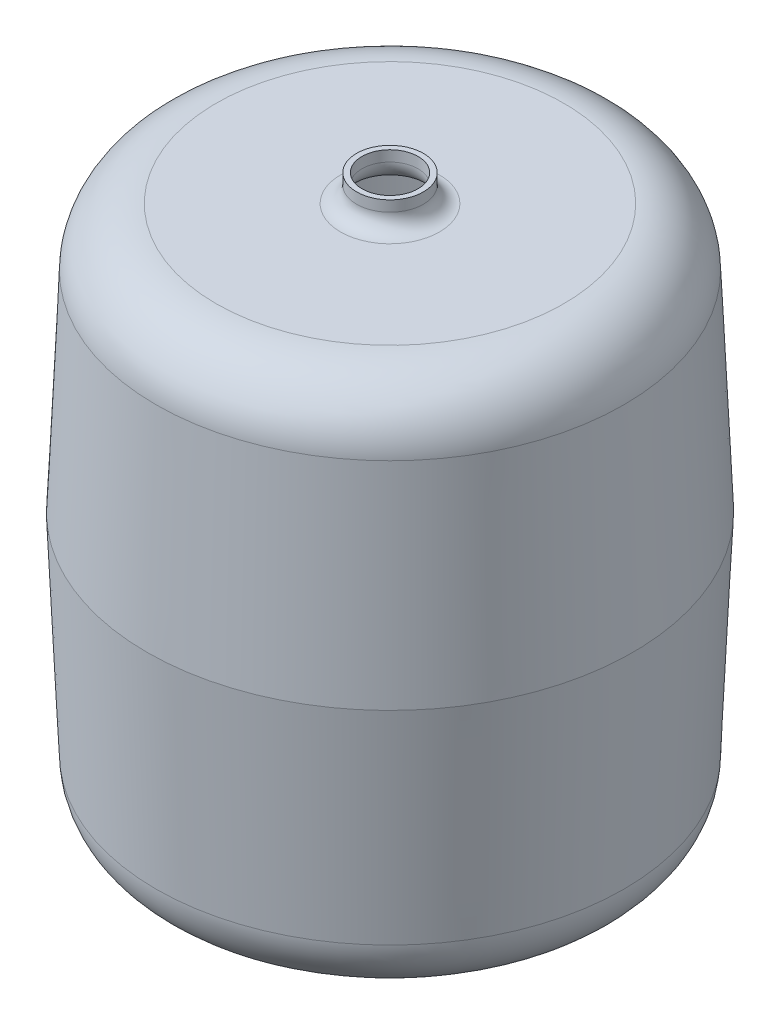
ISO-10303-21;
HEADER;
FILE_DESCRIPTION(('STEP AP214'),'2;1');
FILE_NAME('part.step','',(''),(''),'','','');
FILE_SCHEMA(('AUTOMOTIVE_DESIGN { 1 0 10303 214 1 1 1 1 }'));
ENDSEC;
DATA;
#1=APPLICATION_CONTEXT('core data for automotive mechanical design processes');
#2=APPLICATION_PROTOCOL_DEFINITION('international standard','automotive_design',2000,#1);
#3=PRODUCT_CONTEXT('',#1,'mechanical');
#4=PRODUCT('Part','Part','',(#3));
#5=PRODUCT_RELATED_PRODUCT_CATEGORY('part','',(#4));
#6=PRODUCT_DEFINITION_FORMATION('','',#4);
#7=PRODUCT_DEFINITION_CONTEXT('part definition',#1,'design');
#8=PRODUCT_DEFINITION('design','',#6,#7);
#9=PRODUCT_DEFINITION_SHAPE('','',#8);
#10=(LENGTH_UNIT() NAMED_UNIT(*) SI_UNIT(.MILLI.,.METRE.));
#11=(NAMED_UNIT(*) PLANE_ANGLE_UNIT() SI_UNIT($,.RADIAN.));
#12=(NAMED_UNIT(*) SI_UNIT($,.STERADIAN.) SOLID_ANGLE_UNIT());
#13=UNCERTAINTY_MEASURE_WITH_UNIT(LENGTH_MEASURE(1.E-05),#10,'distance_accuracy_value','');
#14=(GEOMETRIC_REPRESENTATION_CONTEXT(3) GLOBAL_UNCERTAINTY_ASSIGNED_CONTEXT((#13)) GLOBAL_UNIT_ASSIGNED_CONTEXT((#10,
#11,#12)) REPRESENTATION_CONTEXT('',''));
#15=CARTESIAN_POINT('',(0.,0.,0.));
#16=DIRECTION('',(0.,0.,1.));
#17=DIRECTION('',(1.,0.,0.));
#18=AXIS2_PLACEMENT_3D('',#15,#16,#17);
#19=CARTESIAN_POINT('',(0.,4.,0.));
#20=DIRECTION('',(0.,1.,0.));
#21=DIRECTION('',(0.,0.,1.));
#22=AXIS2_PLACEMENT_3D('',#19,#20,#21);
#23=PLANE('',#22);
#24=CARTESIAN_POINT('',(0.,4.,0.));
#25=DIRECTION('',(0.,1.,0.));
#26=DIRECTION('',(0.,0.,1.));
#27=AXIS2_PLACEMENT_3D('',#24,#25,#26);
#28=CIRCLE('',#27,130.042830028816);
#29=CARTESIAN_POINT('',(0.,4.,130.042830028816));
#30=VERTEX_POINT('',#29);
#31=EDGE_CURVE('E91',#30,#30,#28,.T.);
#32=ORIENTED_EDGE('',*,*,#31,.T.);
#33=EDGE_LOOP('',(#32));
#34=FACE_BOUND('',#33,.T.);
#35=ADVANCED_FACE('F39',(#34),#23,.T.);
#36=CARTESIAN_POINT('',(0.,0.,0.));
#37=DIRECTION('',(0.,1.,0.));
#38=DIRECTION('',(0.,0.,1.));
#39=AXIS2_PLACEMENT_3D('',#36,#37,#38);
#40=PLANE('',#39);
#41=CARTESIAN_POINT('',(0.,0.,0.));
#42=DIRECTION('',(0.,1.,0.));
#43=DIRECTION('',(0.,0.,1.));
#44=AXIS2_PLACEMENT_3D('',#41,#42,#43);
#45=CIRCLE('',#44,130.042830028816);
#46=CARTESIAN_POINT('',(0.,0.,130.042830028816));
#47=VERTEX_POINT('',#46);
#48=EDGE_CURVE('E10',#47,#47,#45,.T.);
#49=ORIENTED_EDGE('',*,*,#48,.F.);
#50=EDGE_LOOP('',(#49));
#51=FACE_BOUND('',#50,.T.);
#52=ADVANCED_FACE('F108',(#51),#40,.F.);
#53=CARTESIAN_POINT('',(0.,45.,0.));
#54=DIRECTION('',(0.,1.,0.));
#55=DIRECTION('',(0.,0.,1.));
#56=AXIS2_PLACEMENT_3D('',#53,#54,#55);
#57=TOROIDAL_SURFACE('',#56,130.042830028816,45.);
#58=CARTESIAN_POINT('',(0.,43.03712756856,0.));
#59=DIRECTION('',(0.,1.,0.));
#60=DIRECTION('',(0.,0.,1.));
#61=AXIS2_PLACEMENT_3D('',#58,#59,#60);
#62=CIRCLE('',#61,175.);
#63=CARTESIAN_POINT('',(0.,43.03712756856,175.));
#64=VERTEX_POINT('',#63);
#65=EDGE_CURVE('E45',#64,#64,#62,.T.);
#66=ORIENTED_EDGE('',*,*,#65,.F.);
#67=EDGE_LOOP('',(#66));
#68=FACE_BOUND('',#67,.T.);
#69=ORIENTED_EDGE('',*,*,#48,.T.);
#70=EDGE_LOOP('',(#69));
#71=FACE_BOUND('',#70,.T.);
#72=ADVANCED_FACE('F112',(#68,#71),#57,.T.);
#73=CARTESIAN_POINT('',(0.,43.03712756856,0.));
#74=DIRECTION('',(0.,1.,0.));
#75=DIRECTION('',(0.,0.,1.));
#76=AXIS2_PLACEMENT_3D('',#73,#74,#75);
#77=CONICAL_SURFACE('',#76,175.,0.0436332312998544);
#78=CARTESIAN_POINT('',(0.,200.,0.));
#79=DIRECTION('',(0.,1.,0.));
#80=DIRECTION('',(0.,0.,1.));
#81=AXIS2_PLACEMENT_3D('',#78,#79,#80);
#82=CIRCLE('',#81,181.853147011985);
#83=CARTESIAN_POINT('',(0.,200.,181.853147011985));
#84=VERTEX_POINT('',#83);
#85=EDGE_CURVE('E49',#84,#84,#82,.T.);
#86=ORIENTED_EDGE('',*,*,#85,.F.);
#87=EDGE_LOOP('',(#86));
#88=FACE_BOUND('',#87,.T.);
#89=ORIENTED_EDGE('',*,*,#65,.T.);
#90=EDGE_LOOP('',(#89));
#91=FACE_BOUND('',#90,.T.);
#92=ADVANCED_FACE('F117',(#88,#91),#77,.T.);
#93=CARTESIAN_POINT('',(0.,200.,0.));
#94=DIRECTION('',(0.,-1.,0.));
#95=DIRECTION('',(0.,0.,-1.));
#96=AXIS2_PLACEMENT_3D('',#93,#94,#95);
#97=CONICAL_SURFACE('',#96,181.853147011985,0.0436332312998547);
#98=CARTESIAN_POINT('',(0.,356.96287243144,0.));
#99=DIRECTION('',(0.,1.,0.));
#100=DIRECTION('',(0.,0.,1.));
#101=AXIS2_PLACEMENT_3D('',#98,#99,#100);
#102=CIRCLE('',#101,175.);
#103=CARTESIAN_POINT('',(0.,356.96287243144,175.));
#104=VERTEX_POINT('',#103);
#105=EDGE_CURVE('E53',#104,#104,#102,.T.);
#106=ORIENTED_EDGE('',*,*,#105,.F.);
#107=EDGE_LOOP('',(#106));
#108=FACE_BOUND('',#107,.T.);
#109=ORIENTED_EDGE('',*,*,#85,.T.);
#110=EDGE_LOOP('',(#109));
#111=FACE_BOUND('',#110,.T.);
#112=ADVANCED_FACE('F123',(#108,#111),#97,.T.);
#113=CARTESIAN_POINT('',(0.,355.,0.));
#114=DIRECTION('',(0.,1.,0.));
#115=DIRECTION('',(0.,0.,1.));
#116=AXIS2_PLACEMENT_3D('',#113,#114,#115);
#117=TOROIDAL_SURFACE('',#116,130.042830028816,45.);
#118=CARTESIAN_POINT('',(0.,400.,0.));
#119=DIRECTION('',(0.,1.,0.));
#120=DIRECTION('',(0.,0.,1.));
#121=AXIS2_PLACEMENT_3D('',#118,#119,#120);
#122=CIRCLE('',#121,130.042830028816);
#123=CARTESIAN_POINT('',(0.,400.,130.042830028816));
#124=VERTEX_POINT('',#123);
#125=EDGE_CURVE('E58',#124,#124,#122,.T.);
#126=ORIENTED_EDGE('',*,*,#125,.F.);
#127=EDGE_LOOP('',(#126));
#128=FACE_BOUND('',#127,.T.);
#129=ORIENTED_EDGE('',*,*,#105,.T.);
#130=EDGE_LOOP('',(#129));
#131=FACE_BOUND('',#130,.T.);
#132=ADVANCED_FACE('F127',(#128,#131),#117,.T.);
#133=CARTESIAN_POINT('',(130.042830028816,400.,0.));
#134=DIRECTION('',(0.,-1.,0.));
#135=DIRECTION('',(0.,0.,-1.));
#136=AXIS2_PLACEMENT_3D('',#133,#134,#135);
#137=PLANE('',#136);
#138=CARTESIAN_POINT('',(0.,400.,0.));
#139=DIRECTION('',(0.,1.,0.));
#140=DIRECTION('',(0.,0.,1.));
#141=AXIS2_PLACEMENT_3D('',#138,#139,#140);
#142=CIRCLE('',#141,37.);
#143=CARTESIAN_POINT('',(0.,400.,37.));
#144=VERTEX_POINT('',#143);
#145=EDGE_CURVE('E61',#144,#144,#142,.T.);
#146=ORIENTED_EDGE('',*,*,#145,.F.);
#147=EDGE_LOOP('',(#146));
#148=FACE_BOUND('',#147,.T.);
#149=ORIENTED_EDGE('',*,*,#125,.T.);
#150=EDGE_LOOP('',(#149));
#151=FACE_BOUND('',#150,.T.);
#152=ADVANCED_FACE('F131',(#148,#151),#137,.F.);
#153=CARTESIAN_POINT('',(0.,412.,0.));
#154=DIRECTION('',(0.,1.,0.));
#155=DIRECTION('',(0.,0.,1.));
#156=AXIS2_PLACEMENT_3D('',#153,#154,#155);
#157=TOROIDAL_SURFACE('',#156,37.,12.);
#158=CARTESIAN_POINT('',(0.,412.,0.));
#159=DIRECTION('',(0.,1.,0.));
#160=DIRECTION('',(0.,0.,1.));
#161=AXIS2_PLACEMENT_3D('',#158,#159,#160);
#162=CIRCLE('',#161,25.);
#163=CARTESIAN_POINT('',(0.,412.,25.));
#164=VERTEX_POINT('',#163);
#165=EDGE_CURVE('E64',#164,#164,#162,.T.);
#166=ORIENTED_EDGE('',*,*,#165,.F.);
#167=EDGE_LOOP('',(#166));
#168=FACE_BOUND('',#167,.T.);
#169=ORIENTED_EDGE('',*,*,#145,.T.);
#170=EDGE_LOOP('',(#169));
#171=FACE_BOUND('',#170,.T.);
#172=ADVANCED_FACE('F135',(#168,#171),#157,.F.);
#173=CARTESIAN_POINT('',(0.,434.412205838291,0.));
#174=DIRECTION('',(0.,1.,0.));
#175=DIRECTION('',(0.,0.,1.));
#176=AXIS2_PLACEMENT_3D('',#173,#174,#175);
#177=CYLINDRICAL_SURFACE('',#176,25.);
#178=CARTESIAN_POINT('',(0.,420.,0.));
#179=DIRECTION('',(0.,1.,0.));
#180=DIRECTION('',(0.,0.,1.));
#181=AXIS2_PLACEMENT_3D('',#178,#179,#180);
#182=CIRCLE('',#181,25.);
#183=CARTESIAN_POINT('',(0.,420.,25.));
#184=VERTEX_POINT('',#183);
#185=EDGE_CURVE('E67',#184,#184,#182,.T.);
#186=ORIENTED_EDGE('',*,*,#185,.F.);
#187=EDGE_LOOP('',(#186));
#188=FACE_BOUND('',#187,.T.);
#189=ORIENTED_EDGE('',*,*,#165,.T.);
#190=EDGE_LOOP('',(#189));
#191=FACE_BOUND('',#190,.T.);
#192=ADVANCED_FACE('F139',(#188,#191),#177,.T.);
#193=CARTESIAN_POINT('',(21.,420.,0.));
#194=DIRECTION('',(0.,1.,0.));
#195=DIRECTION('',(0.,0.,1.));
#196=AXIS2_PLACEMENT_3D('',#193,#194,#195);
#197=PLANE('',#196);
#198=ORIENTED_EDGE('',*,*,#185,.T.);
#199=EDGE_LOOP('',(#198));
#200=FACE_BOUND('',#199,.T.);
#201=CARTESIAN_POINT('',(0.,420.,0.));
#202=DIRECTION('',(0.,1.,0.));
#203=DIRECTION('',(0.,0.,1.));
#204=AXIS2_PLACEMENT_3D('',#201,#202,#203);
#205=CIRCLE('',#204,21.);
#206=CARTESIAN_POINT('',(0.,420.,21.));
#207=VERTEX_POINT('',#206);
#208=EDGE_CURVE('E70',#207,#207,#205,.T.);
#209=ORIENTED_EDGE('',*,*,#208,.F.);
#210=EDGE_LOOP('',(#209));
#211=FACE_BOUND('',#210,.T.);
#212=ADVANCED_FACE('F143',(#200,#211),#197,.T.);
#213=CARTESIAN_POINT('',(0.,434.412205838291,0.));
#214=DIRECTION('',(0.,1.,0.));
#215=DIRECTION('',(0.,0.,1.));
#216=AXIS2_PLACEMENT_3D('',#213,#214,#215);
#217=CYLINDRICAL_SURFACE('',#216,21.);
#218=ORIENTED_EDGE('',*,*,#208,.T.);
#219=EDGE_LOOP('',(#218));
#220=FACE_BOUND('',#219,.T.);
#221=CARTESIAN_POINT('',(0.,412.,0.));
#222=DIRECTION('',(0.,1.,0.));
#223=DIRECTION('',(0.,0.,1.));
#224=AXIS2_PLACEMENT_3D('',#221,#222,#223);
#225=CIRCLE('',#224,21.);
#226=CARTESIAN_POINT('',(0.,412.,21.));
#227=VERTEX_POINT('',#226);
#228=EDGE_CURVE('E73',#227,#227,#225,.T.);
#229=ORIENTED_EDGE('',*,*,#228,.F.);
#230=EDGE_LOOP('',(#229));
#231=FACE_BOUND('',#230,.T.);
#232=ADVANCED_FACE('F147',(#220,#231),#217,.F.);
#233=CARTESIAN_POINT('',(0.,412.,0.));
#234=DIRECTION('',(0.,1.,0.));
#235=DIRECTION('',(0.,0.,1.));
#236=AXIS2_PLACEMENT_3D('',#233,#234,#235);
#237=TOROIDAL_SURFACE('',#236,37.,16.);
#238=ORIENTED_EDGE('',*,*,#228,.T.);
#239=EDGE_LOOP('',(#238));
#240=FACE_BOUND('',#239,.T.);
#241=CARTESIAN_POINT('',(0.,396.,0.));
#242=DIRECTION('',(0.,1.,0.));
#243=DIRECTION('',(0.,0.,1.));
#244=AXIS2_PLACEMENT_3D('',#241,#242,#243);
#245=CIRCLE('',#244,37.);
#246=CARTESIAN_POINT('',(0.,396.,37.));
#247=VERTEX_POINT('',#246);
#248=EDGE_CURVE('E76',#247,#247,#245,.T.);
#249=ORIENTED_EDGE('',*,*,#248,.F.);
#250=EDGE_LOOP('',(#249));
#251=FACE_BOUND('',#250,.T.);
#252=ADVANCED_FACE('F151',(#240,#251),#237,.T.);
#253=CARTESIAN_POINT('',(130.042830028816,396.,0.));
#254=DIRECTION('',(0.,-1.,0.));
#255=DIRECTION('',(0.,0.,-1.));
#256=AXIS2_PLACEMENT_3D('',#253,#254,#255);
#257=PLANE('',#256);
#258=ORIENTED_EDGE('',*,*,#248,.T.);
#259=EDGE_LOOP('',(#258));
#260=FACE_BOUND('',#259,.T.);
#261=CARTESIAN_POINT('',(0.,396.,0.));
#262=DIRECTION('',(0.,1.,0.));
#263=DIRECTION('',(0.,0.,1.));
#264=AXIS2_PLACEMENT_3D('',#261,#262,#263);
#265=CIRCLE('',#264,130.042830028816);
#266=CARTESIAN_POINT('',(0.,396.,130.042830028816));
#267=VERTEX_POINT('',#266);
#268=EDGE_CURVE('E79',#267,#267,#265,.T.);
#269=ORIENTED_EDGE('',*,*,#268,.F.);
#270=EDGE_LOOP('',(#269));
#271=FACE_BOUND('',#270,.T.);
#272=ADVANCED_FACE('F155',(#260,#271),#257,.T.);
#273=CARTESIAN_POINT('',(0.,355.,0.));
#274=DIRECTION('',(0.,1.,0.));
#275=DIRECTION('',(0.,0.,1.));
#276=AXIS2_PLACEMENT_3D('',#273,#274,#275);
#277=TOROIDAL_SURFACE('',#276,130.042830028816,41.);
#278=ORIENTED_EDGE('',*,*,#268,.T.);
#279=EDGE_LOOP('',(#278));
#280=FACE_BOUND('',#279,.T.);
#281=CARTESIAN_POINT('',(0.,356.788394881979,0.));
#282=DIRECTION('',(0.,1.,0.));
#283=DIRECTION('',(0.,0.,1.));
#284=AXIS2_PLACEMENT_3D('',#281,#282,#283);
#285=CIRCLE('',#284,171.003807113672);
#286=CARTESIAN_POINT('',(0.,356.788394881979,171.003807113672));
#287=VERTEX_POINT('',#286);
#288=EDGE_CURVE('E82',#287,#287,#285,.T.);
#289=ORIENTED_EDGE('',*,*,#288,.F.);
#290=EDGE_LOOP('',(#289));
#291=FACE_BOUND('',#290,.T.);
#292=ADVANCED_FACE('F159',(#280,#291),#277,.F.);
#293=CARTESIAN_POINT('',(0.,200.,0.));
#294=DIRECTION('',(0.,-1.,0.));
#295=DIRECTION('',(0.,0.,-1.));
#296=AXIS2_PLACEMENT_3D('',#293,#294,#295);
#297=CONICAL_SURFACE('',#296,177.849336271331,0.0436332312998549);
#298=ORIENTED_EDGE('',*,*,#288,.T.);
#299=EDGE_LOOP('',(#298));
#300=FACE_BOUND('',#299,.T.);
#301=CARTESIAN_POINT('',(0.,200.,0.));
#302=DIRECTION('',(0.,1.,0.));
#303=DIRECTION('',(0.,0.,1.));
#304=AXIS2_PLACEMENT_3D('',#301,#302,#303);
#305=CIRCLE('',#304,177.849336271331);
#306=CARTESIAN_POINT('',(0.,200.,177.849336271331));
#307=VERTEX_POINT('',#306);
#308=EDGE_CURVE('E85',#307,#307,#305,.T.);
#309=ORIENTED_EDGE('',*,*,#308,.F.);
#310=EDGE_LOOP('',(#309));
#311=FACE_BOUND('',#310,.T.);
#312=ADVANCED_FACE('F104',(#300,#311),#297,.F.);
#313=CARTESIAN_POINT('',(0.,43.2116051180214,0.));
#314=DIRECTION('',(0.,1.,0.));
#315=DIRECTION('',(0.,0.,1.));
#316=AXIS2_PLACEMENT_3D('',#313,#314,#315);
#317=CONICAL_SURFACE('',#316,171.003807113673,0.0436332312998542);
#318=ORIENTED_EDGE('',*,*,#308,.T.);
#319=EDGE_LOOP('',(#318));
#320=FACE_BOUND('',#319,.T.);
#321=CARTESIAN_POINT('',(0.,43.2116051180214,0.));
#322=DIRECTION('',(0.,1.,0.));
#323=DIRECTION('',(0.,0.,1.));
#324=AXIS2_PLACEMENT_3D('',#321,#322,#323);
#325=CIRCLE('',#324,171.003807113673);
#326=CARTESIAN_POINT('',(0.,43.2116051180214,171.003807113673));
#327=VERTEX_POINT('',#326);
#328=EDGE_CURVE('E88',#327,#327,#325,.T.);
#329=ORIENTED_EDGE('',*,*,#328,.F.);
#330=EDGE_LOOP('',(#329));
#331=FACE_BOUND('',#330,.T.);
#332=ADVANCED_FACE('F98',(#320,#331),#317,.F.);
#333=CARTESIAN_POINT('',(0.,45.,0.));
#334=DIRECTION('',(0.,1.,0.));
#335=DIRECTION('',(0.,0.,1.));
#336=AXIS2_PLACEMENT_3D('',#333,#334,#335);
#337=TOROIDAL_SURFACE('',#336,130.042830028816,41.);
#338=ORIENTED_EDGE('',*,*,#328,.T.);
#339=EDGE_LOOP('',(#338));
#340=FACE_BOUND('',#339,.T.);
#341=ORIENTED_EDGE('',*,*,#31,.F.);
#342=EDGE_LOOP('',(#341));
#343=FACE_BOUND('',#342,.T.);
#344=ADVANCED_FACE('F96',(#340,#343),#337,.F.);
#345=CLOSED_SHELL('',(#35,#52,#72,#92,#112,#132,#152,#172,#192,#212,#232,#252,#272,#292,#312,
#332,#344));
#346=MANIFOLD_SOLID_BREP('B2',#345);
#347=ADVANCED_BREP_SHAPE_REPRESENTATION('',(#18,#346),#14);
#348=SHAPE_DEFINITION_REPRESENTATION(#9,#347);
ENDSEC;
END-ISO-10303-21;
